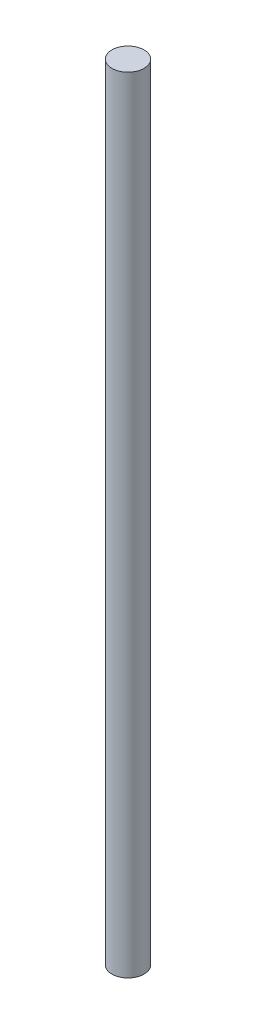
ISO-10303-21;
HEADER;
FILE_DESCRIPTION(('STEP AP214'),'2;1');
FILE_NAME('part.step','',(''),(''),'','','');
FILE_SCHEMA(('AUTOMOTIVE_DESIGN { 1 0 10303 214 1 1 1 1 }'));
ENDSEC;
DATA;
#1=APPLICATION_CONTEXT('core data for automotive mechanical design processes');
#2=APPLICATION_PROTOCOL_DEFINITION('international standard','automotive_design',2000,#1);
#3=PRODUCT_CONTEXT('',#1,'mechanical');
#4=PRODUCT('Part','Part','',(#3));
#5=PRODUCT_RELATED_PRODUCT_CATEGORY('part','',(#4));
#6=PRODUCT_DEFINITION_FORMATION('','',#4);
#7=PRODUCT_DEFINITION_CONTEXT('part definition',#1,'design');
#8=PRODUCT_DEFINITION('design','',#6,#7);
#9=PRODUCT_DEFINITION_SHAPE('','',#8);
#10=(LENGTH_UNIT() NAMED_UNIT(*) SI_UNIT(.MILLI.,.METRE.));
#11=(NAMED_UNIT(*) PLANE_ANGLE_UNIT() SI_UNIT($,.RADIAN.));
#12=(NAMED_UNIT(*) SI_UNIT($,.STERADIAN.) SOLID_ANGLE_UNIT());
#13=UNCERTAINTY_MEASURE_WITH_UNIT(LENGTH_MEASURE(1.E-05),#10,'distance_accuracy_value','');
#14=(GEOMETRIC_REPRESENTATION_CONTEXT(3) GLOBAL_UNCERTAINTY_ASSIGNED_CONTEXT((#13)) GLOBAL_UNIT_ASSIGNED_CONTEXT((#10,
#11,#12)) REPRESENTATION_CONTEXT('',''));
#15=CARTESIAN_POINT('',(0.,0.,0.));
#16=DIRECTION('',(0.,0.,1.));
#17=DIRECTION('',(1.,0.,0.));
#18=AXIS2_PLACEMENT_3D('',#15,#16,#17);
#19=CARTESIAN_POINT('',(0.,110.,0.));
#20=DIRECTION('',(0.,-1.,0.));
#21=DIRECTION('',(0.,0.,-1.));
#22=AXIS2_PLACEMENT_3D('',#19,#20,#21);
#23=CYLINDRICAL_SURFACE('',#22,2.25);
#24=CARTESIAN_POINT('',(0.,110.,0.));
#25=DIRECTION('',(0.,1.,0.));
#26=DIRECTION('',(0.,0.,1.));
#27=AXIS2_PLACEMENT_3D('',#24,#25,#26);
#28=CIRCLE('',#27,2.25);
#29=CARTESIAN_POINT('',(0.,110.,2.25));
#30=VERTEX_POINT('',#29);
#31=EDGE_CURVE('E10',#30,#30,#28,.T.);
#32=ORIENTED_EDGE('',*,*,#31,.F.);
#33=EDGE_LOOP('',(#32));
#34=FACE_BOUND('',#33,.T.);
#35=CARTESIAN_POINT('',(0.,0.,0.));
#36=DIRECTION('',(0.,1.,0.));
#37=DIRECTION('',(0.,0.,1.));
#38=AXIS2_PLACEMENT_3D('',#35,#36,#37);
#39=CIRCLE('',#38,2.25);
#40=CARTESIAN_POINT('',(0.,0.,2.25));
#41=VERTEX_POINT('',#40);
#42=EDGE_CURVE('E40',#41,#41,#39,.T.);
#43=ORIENTED_EDGE('',*,*,#42,.T.);
#44=EDGE_LOOP('',(#43));
#45=FACE_BOUND('',#44,.T.);
#46=ADVANCED_FACE('F37',(#34,#45),#23,.T.);
#47=CARTESIAN_POINT('',(0.,110.,0.));
#48=DIRECTION('',(0.,1.,0.));
#49=DIRECTION('',(0.,0.,1.));
#50=AXIS2_PLACEMENT_3D('',#47,#48,#49);
#51=PLANE('',#50);
#52=ORIENTED_EDGE('',*,*,#31,.T.);
#53=EDGE_LOOP('',(#52));
#54=FACE_BOUND('',#53,.T.);
#55=ADVANCED_FACE('F54',(#54),#51,.T.);
#56=CARTESIAN_POINT('',(0.,0.,0.));
#57=DIRECTION('',(0.,1.,0.));
#58=DIRECTION('',(0.,0.,1.));
#59=AXIS2_PLACEMENT_3D('',#56,#57,#58);
#60=PLANE('',#59);
#61=ORIENTED_EDGE('',*,*,#42,.F.);
#62=EDGE_LOOP('',(#61));
#63=FACE_BOUND('',#62,.T.);
#64=ADVANCED_FACE('F52',(#63),#60,.F.);
#65=CLOSED_SHELL('',(#46,#55,#64));
#66=MANIFOLD_SOLID_BREP('B2',#65);
#67=ADVANCED_BREP_SHAPE_REPRESENTATION('',(#18,#66),#14);
#68=SHAPE_DEFINITION_REPRESENTATION(#9,#67);
ENDSEC;
END-ISO-10303-21;
